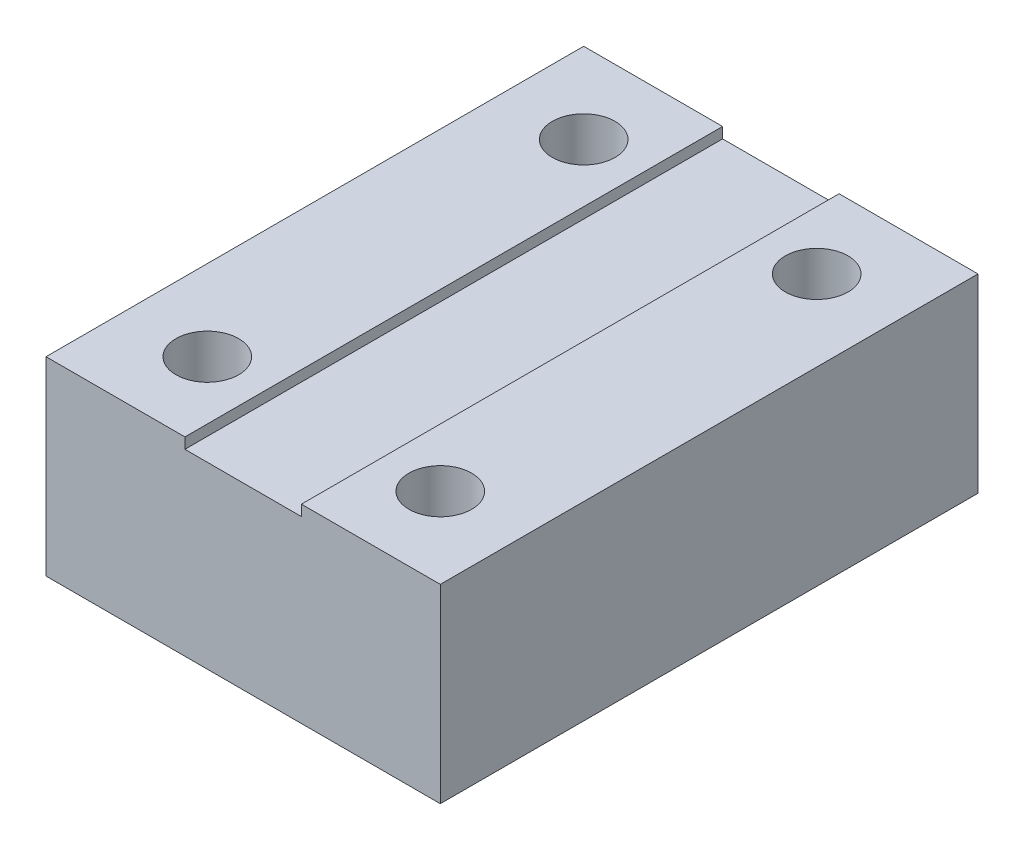
ISO-10303-21;
HEADER;
FILE_DESCRIPTION(('STEP AP214'),'2;1');
FILE_NAME('part.step','',(''),(''),'','','');
FILE_SCHEMA(('AUTOMOTIVE_DESIGN { 1 0 10303 214 1 1 1 1 }'));
ENDSEC;
DATA;
#1=APPLICATION_CONTEXT('core data for automotive mechanical design processes');
#2=APPLICATION_PROTOCOL_DEFINITION('international standard','automotive_design',2000,#1);
#3=PRODUCT_CONTEXT('',#1,'mechanical');
#4=PRODUCT('Part','Part','',(#3));
#5=PRODUCT_RELATED_PRODUCT_CATEGORY('part','',(#4));
#6=PRODUCT_DEFINITION_FORMATION('','',#4);
#7=PRODUCT_DEFINITION_CONTEXT('part definition',#1,'design');
#8=PRODUCT_DEFINITION('design','',#6,#7);
#9=PRODUCT_DEFINITION_SHAPE('','',#8);
#10=(LENGTH_UNIT() NAMED_UNIT(*) SI_UNIT(.MILLI.,.METRE.));
#11=(NAMED_UNIT(*) PLANE_ANGLE_UNIT() SI_UNIT($,.RADIAN.));
#12=(NAMED_UNIT(*) SI_UNIT($,.STERADIAN.) SOLID_ANGLE_UNIT());
#13=UNCERTAINTY_MEASURE_WITH_UNIT(LENGTH_MEASURE(1.E-05),#10,'distance_accuracy_value','');
#14=(GEOMETRIC_REPRESENTATION_CONTEXT(3) GLOBAL_UNCERTAINTY_ASSIGNED_CONTEXT((#13)) GLOBAL_UNIT_ASSIGNED_CONTEXT((#10,
#11,#12)) REPRESENTATION_CONTEXT('',''));
#15=CARTESIAN_POINT('',(0.,0.,0.));
#16=DIRECTION('',(0.,0.,1.));
#17=DIRECTION('',(1.,0.,0.));
#18=AXIS2_PLACEMENT_3D('',#15,#16,#17);
#19=CARTESIAN_POINT('',(-11.,5.3,15.));
#20=DIRECTION('',(0.,-1.,0.));
#21=DIRECTION('',(0.,0.,-1.));
#22=AXIS2_PLACEMENT_3D('',#19,#20,#21);
#23=PLANE('',#22);
#24=CARTESIAN_POINT('',(-6.5,5.3,10.5));
#25=DIRECTION('',(0.,1.,0.));
#26=DIRECTION('',(0.,0.,1.));
#27=AXIS2_PLACEMENT_3D('',#24,#25,#26);
#28=CIRCLE('',#27,1.75);
#29=CARTESIAN_POINT('',(-6.5,5.3,12.25));
#30=VERTEX_POINT('',#29);
#31=EDGE_CURVE('E156',#30,#30,#28,.T.);
#32=ORIENTED_EDGE('',*,*,#31,.F.);
#33=EDGE_LOOP('',(#32));
#34=FACE_BOUND('',#33,.T.);
#35=CARTESIAN_POINT('',(-6.5,5.3,-10.5));
#36=DIRECTION('',(0.,1.,0.));
#37=DIRECTION('',(0.,0.,1.));
#38=AXIS2_PLACEMENT_3D('',#35,#36,#37);
#39=CIRCLE('',#38,1.75);
#40=CARTESIAN_POINT('',(-6.5,5.3,-8.75));
#41=VERTEX_POINT('',#40);
#42=EDGE_CURVE('E159',#41,#41,#39,.T.);
#43=ORIENTED_EDGE('',*,*,#42,.F.);
#44=EDGE_LOOP('',(#43));
#45=FACE_BOUND('',#44,.T.);
#46=DIRECTION('',(0.,0.,-1.));
#47=VECTOR('',#46,1.);
#48=CARTESIAN_POINT('',(-3.25,5.3,15.));
#49=LINE('',#48,#47);
#50=CARTESIAN_POINT('',(-3.25,5.3,15.));
#51=VERTEX_POINT('',#50);
#52=CARTESIAN_POINT('',(-3.25,5.3,-15.));
#53=VERTEX_POINT('',#52);
#54=EDGE_CURVE('E122',#51,#53,#49,.T.);
#55=ORIENTED_EDGE('',*,*,#54,.T.);
#56=DIRECTION('',(-1.,0.,0.));
#57=VECTOR('',#56,1.);
#58=CARTESIAN_POINT('',(-11.,5.3,-15.));
#59=LINE('',#58,#57);
#60=CARTESIAN_POINT('',(-11.,5.3,-15.));
#61=VERTEX_POINT('',#60);
#62=EDGE_CURVE('E176',#53,#61,#59,.T.);
#63=ORIENTED_EDGE('',*,*,#62,.T.);
#64=DIRECTION('',(0.,0.,-1.));
#65=VECTOR('',#64,1.);
#66=CARTESIAN_POINT('',(-11.,5.3,15.));
#67=LINE('',#66,#65);
#68=CARTESIAN_POINT('',(-11.,5.3,15.));
#69=VERTEX_POINT('',#68);
#70=EDGE_CURVE('E43',#69,#61,#67,.T.);
#71=ORIENTED_EDGE('',*,*,#70,.F.);
#72=DIRECTION('',(-1.,0.,0.));
#73=VECTOR('',#72,1.);
#74=CARTESIAN_POINT('',(-11.,5.3,15.));
#75=LINE('',#74,#73);
#76=EDGE_CURVE('E168',#51,#69,#75,.T.);
#77=ORIENTED_EDGE('',*,*,#76,.F.);
#78=EDGE_LOOP('',(#55,#63,#71,#77));
#79=FACE_BOUND('',#78,.T.);
#80=ADVANCED_FACE('F35',(#34,#45,#79),#23,.F.);
#81=CARTESIAN_POINT('',(0.,0.,15.));
#82=DIRECTION('',(0.,0.,-1.));
#83=DIRECTION('',(-1.,0.,0.));
#84=AXIS2_PLACEMENT_3D('',#81,#82,#83);
#85=PLANE('',#84);
#86=DIRECTION('',(0.,1.,0.));
#87=VECTOR('',#86,1.);
#88=CARTESIAN_POINT('',(-3.25,4.7,15.));
#89=LINE('',#88,#87);
#90=CARTESIAN_POINT('',(-3.25,4.7,15.));
#91=VERTEX_POINT('',#90);
#92=EDGE_CURVE('E119',#91,#51,#89,.T.);
#93=ORIENTED_EDGE('',*,*,#92,.T.);
#94=ORIENTED_EDGE('',*,*,#76,.T.);
#95=DIRECTION('',(0.,-1.,0.));
#96=VECTOR('',#95,1.);
#97=CARTESIAN_POINT('',(-11.,-5.3,15.));
#98=LINE('',#97,#96);
#99=CARTESIAN_POINT('',(-11.,-5.3,15.));
#100=VERTEX_POINT('',#99);
#101=EDGE_CURVE('E170',#69,#100,#98,.T.);
#102=ORIENTED_EDGE('',*,*,#101,.T.);
#103=DIRECTION('',(1.,0.,0.));
#104=VECTOR('',#103,1.);
#105=CARTESIAN_POINT('',(-11.,-5.3,15.));
#106=LINE('',#105,#104);
#107=CARTESIAN_POINT('',(11.,-5.3,15.));
#108=VERTEX_POINT('',#107);
#109=EDGE_CURVE('E59',#100,#108,#106,.T.);
#110=ORIENTED_EDGE('',*,*,#109,.T.);
#111=DIRECTION('',(0.,1.,0.));
#112=VECTOR('',#111,1.);
#113=CARTESIAN_POINT('',(11.,-5.3,15.));
#114=LINE('',#113,#112);
#115=CARTESIAN_POINT('',(11.,5.3,15.));
#116=VERTEX_POINT('',#115);
#117=EDGE_CURVE('E166',#108,#116,#114,.T.);
#118=ORIENTED_EDGE('',*,*,#117,.T.);
#119=CARTESIAN_POINT('',(3.25,5.3,15.));
#120=VERTEX_POINT('',#119);
#121=EDGE_CURVE('E87',#116,#120,#75,.T.);
#122=ORIENTED_EDGE('',*,*,#121,.T.);
#123=DIRECTION('',(0.,1.,0.));
#124=VECTOR('',#123,1.);
#125=CARTESIAN_POINT('',(3.25,4.7,15.));
#126=LINE('',#125,#124);
#127=CARTESIAN_POINT('',(3.25,4.7,15.));
#128=VERTEX_POINT('',#127);
#129=EDGE_CURVE('E129',#128,#120,#126,.T.);
#130=ORIENTED_EDGE('',*,*,#129,.F.);
#131=DIRECTION('',(-1.,0.,0.));
#132=VECTOR('',#131,1.);
#133=CARTESIAN_POINT('',(3.25,4.7,15.));
#134=LINE('',#133,#132);
#135=EDGE_CURVE('E112',#128,#91,#134,.T.);
#136=ORIENTED_EDGE('',*,*,#135,.T.);
#137=EDGE_LOOP('',(#93,#94,#102,#110,#118,#122,#130,#136));
#138=FACE_BOUND('',#137,.T.);
#139=ADVANCED_FACE('F128',(#138),#85,.F.);
#140=CARTESIAN_POINT('',(0.,0.,-15.));
#141=DIRECTION('',(0.,0.,-1.));
#142=DIRECTION('',(-1.,0.,0.));
#143=AXIS2_PLACEMENT_3D('',#140,#141,#142);
#144=PLANE('',#143);
#145=ORIENTED_EDGE('',*,*,#62,.F.);
#146=DIRECTION('',(0.,1.,0.));
#147=VECTOR('',#146,1.);
#148=CARTESIAN_POINT('',(-3.25,4.7,-15.));
#149=LINE('',#148,#147);
#150=CARTESIAN_POINT('',(-3.25,4.7,-15.));
#151=VERTEX_POINT('',#150);
#152=EDGE_CURVE('E125',#151,#53,#149,.T.);
#153=ORIENTED_EDGE('',*,*,#152,.F.);
#154=DIRECTION('',(-1.,0.,0.));
#155=VECTOR('',#154,1.);
#156=CARTESIAN_POINT('',(3.25,4.7,-15.));
#157=LINE('',#156,#155);
#158=CARTESIAN_POINT('',(3.25,4.7,-15.));
#159=VERTEX_POINT('',#158);
#160=EDGE_CURVE('E114',#159,#151,#157,.T.);
#161=ORIENTED_EDGE('',*,*,#160,.F.);
#162=DIRECTION('',(0.,1.,0.));
#163=VECTOR('',#162,1.);
#164=CARTESIAN_POINT('',(3.25,4.7,-15.));
#165=LINE('',#164,#163);
#166=CARTESIAN_POINT('',(3.25,5.3,-15.));
#167=VERTEX_POINT('',#166);
#168=EDGE_CURVE('E138',#159,#167,#165,.T.);
#169=ORIENTED_EDGE('',*,*,#168,.T.);
#170=CARTESIAN_POINT('',(11.,5.3,-15.));
#171=VERTEX_POINT('',#170);
#172=EDGE_CURVE('E177',#171,#167,#59,.T.);
#173=ORIENTED_EDGE('',*,*,#172,.F.);
#174=DIRECTION('',(0.,1.,0.));
#175=VECTOR('',#174,1.);
#176=CARTESIAN_POINT('',(11.,-5.3,-15.));
#177=LINE('',#176,#175);
#178=CARTESIAN_POINT('',(11.,-5.3,-15.));
#179=VERTEX_POINT('',#178);
#180=EDGE_CURVE('E165',#179,#171,#177,.T.);
#181=ORIENTED_EDGE('',*,*,#180,.F.);
#182=DIRECTION('',(1.,0.,0.));
#183=VECTOR('',#182,1.);
#184=CARTESIAN_POINT('',(-11.,-5.3,-15.));
#185=LINE('',#184,#183);
#186=CARTESIAN_POINT('',(-11.,-5.3,-15.));
#187=VERTEX_POINT('',#186);
#188=EDGE_CURVE('E80',#187,#179,#185,.T.);
#189=ORIENTED_EDGE('',*,*,#188,.F.);
#190=DIRECTION('',(0.,-1.,0.));
#191=VECTOR('',#190,1.);
#192=CARTESIAN_POINT('',(-11.,-5.3,-15.));
#193=LINE('',#192,#191);
#194=EDGE_CURVE('E180',#61,#187,#193,.T.);
#195=ORIENTED_EDGE('',*,*,#194,.F.);
#196=EDGE_LOOP('',(#145,#153,#161,#169,#173,#181,#189,#195));
#197=FACE_BOUND('',#196,.T.);
#198=ADVANCED_FACE('F195',(#197),#144,.T.);
#199=CARTESIAN_POINT('',(11.,-5.3,15.));
#200=DIRECTION('',(-1.,0.,0.));
#201=DIRECTION('',(0.,0.,1.));
#202=AXIS2_PLACEMENT_3D('',#199,#200,#201);
#203=PLANE('',#202);
#204=ORIENTED_EDGE('',*,*,#180,.T.);
#205=DIRECTION('',(0.,0.,-1.));
#206=VECTOR('',#205,1.);
#207=CARTESIAN_POINT('',(11.,5.3,15.));
#208=LINE('',#207,#206);
#209=EDGE_CURVE('E11',#116,#171,#208,.T.);
#210=ORIENTED_EDGE('',*,*,#209,.F.);
#211=ORIENTED_EDGE('',*,*,#117,.F.);
#212=DIRECTION('',(0.,0.,-1.));
#213=VECTOR('',#212,1.);
#214=CARTESIAN_POINT('',(11.,-5.3,15.));
#215=LINE('',#214,#213);
#216=EDGE_CURVE('E173',#108,#179,#215,.T.);
#217=ORIENTED_EDGE('',*,*,#216,.T.);
#218=EDGE_LOOP('',(#204,#210,#211,#217));
#219=FACE_BOUND('',#218,.T.);
#220=ADVANCED_FACE('F37',(#219),#203,.F.);
#221=CARTESIAN_POINT('',(6.5,5.3,-10.5));
#222=DIRECTION('',(0.,1.,0.));
#223=DIRECTION('',(0.,0.,1.));
#224=AXIS2_PLACEMENT_3D('',#221,#222,#223);
#225=CIRCLE('',#224,1.75);
#226=CARTESIAN_POINT('',(6.5,5.3,-8.75));
#227=VERTEX_POINT('',#226);
#228=EDGE_CURVE('E144',#227,#227,#225,.T.);
#229=ORIENTED_EDGE('',*,*,#228,.F.);
#230=EDGE_LOOP('',(#229));
#231=FACE_BOUND('',#230,.T.);
#232=CARTESIAN_POINT('',(6.5,5.3,10.5));
#233=DIRECTION('',(0.,1.,0.));
#234=DIRECTION('',(0.,0.,1.));
#235=AXIS2_PLACEMENT_3D('',#232,#233,#234);
#236=CIRCLE('',#235,1.75);
#237=CARTESIAN_POINT('',(6.5,5.3,12.25));
#238=VERTEX_POINT('',#237);
#239=EDGE_CURVE('E150',#238,#238,#236,.T.);
#240=ORIENTED_EDGE('',*,*,#239,.F.);
#241=EDGE_LOOP('',(#240));
#242=FACE_BOUND('',#241,.T.);
#243=ORIENTED_EDGE('',*,*,#172,.T.);
#244=DIRECTION('',(0.,0.,-1.));
#245=VECTOR('',#244,1.);
#246=CARTESIAN_POINT('',(3.25,5.3,15.));
#247=LINE('',#246,#245);
#248=EDGE_CURVE('E130',#120,#167,#247,.T.);
#249=ORIENTED_EDGE('',*,*,#248,.F.);
#250=ORIENTED_EDGE('',*,*,#121,.F.);
#251=ORIENTED_EDGE('',*,*,#209,.T.);
#252=EDGE_LOOP('',(#243,#249,#250,#251));
#253=FACE_BOUND('',#252,.T.);
#254=ADVANCED_FACE('F212',(#231,#242,#253),#23,.F.);
#255=CARTESIAN_POINT('',(-11.,-5.3,15.));
#256=DIRECTION('',(1.,0.,0.));
#257=DIRECTION('',(0.,0.,-1.));
#258=AXIS2_PLACEMENT_3D('',#255,#256,#257);
#259=PLANE('',#258);
#260=ORIENTED_EDGE('',*,*,#194,.T.);
#261=DIRECTION('',(0.,0.,-1.));
#262=VECTOR('',#261,1.);
#263=CARTESIAN_POINT('',(-11.,-5.3,15.));
#264=LINE('',#263,#262);
#265=EDGE_CURVE('E184',#100,#187,#264,.T.);
#266=ORIENTED_EDGE('',*,*,#265,.F.);
#267=ORIENTED_EDGE('',*,*,#101,.F.);
#268=ORIENTED_EDGE('',*,*,#70,.T.);
#269=EDGE_LOOP('',(#260,#266,#267,#268));
#270=FACE_BOUND('',#269,.T.);
#271=ADVANCED_FACE('F190',(#270),#259,.F.);
#272=CARTESIAN_POINT('',(-11.,-5.3,15.));
#273=DIRECTION('',(0.,1.,0.));
#274=DIRECTION('',(0.,0.,1.));
#275=AXIS2_PLACEMENT_3D('',#272,#273,#274);
#276=PLANE('',#275);
#277=CARTESIAN_POINT('',(6.5,-5.3,-10.5));
#278=DIRECTION('',(0.,1.,0.));
#279=DIRECTION('',(0.,0.,1.));
#280=AXIS2_PLACEMENT_3D('',#277,#278,#279);
#281=CIRCLE('',#280,1.75);
#282=CARTESIAN_POINT('',(6.5,-5.3,-8.75));
#283=VERTEX_POINT('',#282);
#284=EDGE_CURVE('E124',#283,#283,#281,.F.);
#285=ORIENTED_EDGE('',*,*,#284,.F.);
#286=EDGE_LOOP('',(#285));
#287=FACE_BOUND('',#286,.T.);
#288=CARTESIAN_POINT('',(6.5,-5.3,10.5));
#289=DIRECTION('',(0.,1.,0.));
#290=DIRECTION('',(0.,0.,1.));
#291=AXIS2_PLACEMENT_3D('',#288,#289,#290);
#292=CIRCLE('',#291,1.75);
#293=CARTESIAN_POINT('',(6.5,-5.3,12.25));
#294=VERTEX_POINT('',#293);
#295=EDGE_CURVE('E147',#294,#294,#292,.F.);
#296=ORIENTED_EDGE('',*,*,#295,.F.);
#297=EDGE_LOOP('',(#296));
#298=FACE_BOUND('',#297,.T.);
#299=CARTESIAN_POINT('',(-6.5,-5.3,10.5));
#300=DIRECTION('',(0.,1.,0.));
#301=DIRECTION('',(0.,0.,1.));
#302=AXIS2_PLACEMENT_3D('',#299,#300,#301);
#303=CIRCLE('',#302,1.75);
#304=CARTESIAN_POINT('',(-6.5,-5.3,12.25));
#305=VERTEX_POINT('',#304);
#306=EDGE_CURVE('E153',#305,#305,#303,.F.);
#307=ORIENTED_EDGE('',*,*,#306,.F.);
#308=EDGE_LOOP('',(#307));
#309=FACE_BOUND('',#308,.T.);
#310=CARTESIAN_POINT('',(-6.5,-5.3,-10.5));
#311=DIRECTION('',(0.,1.,0.));
#312=DIRECTION('',(0.,0.,1.));
#313=AXIS2_PLACEMENT_3D('',#310,#311,#312);
#314=CIRCLE('',#313,1.75);
#315=CARTESIAN_POINT('',(-6.5,-5.3,-8.75));
#316=VERTEX_POINT('',#315);
#317=EDGE_CURVE('E162',#316,#316,#314,.F.);
#318=ORIENTED_EDGE('',*,*,#317,.F.);
#319=EDGE_LOOP('',(#318));
#320=FACE_BOUND('',#319,.T.);
#321=ORIENTED_EDGE('',*,*,#188,.T.);
#322=ORIENTED_EDGE('',*,*,#216,.F.);
#323=ORIENTED_EDGE('',*,*,#109,.F.);
#324=ORIENTED_EDGE('',*,*,#265,.T.);
#325=EDGE_LOOP('',(#321,#322,#323,#324));
#326=FACE_BOUND('',#325,.T.);
#327=ADVANCED_FACE('F200',(#287,#298,#309,#320,#326),#276,.F.);
#328=CARTESIAN_POINT('',(-6.5,-5.301,-10.5));
#329=DIRECTION('',(0.,1.,0.));
#330=DIRECTION('',(0.,0.,1.));
#331=AXIS2_PLACEMENT_3D('',#328,#329,#330);
#332=CYLINDRICAL_SURFACE('',#331,1.75);
#333=ORIENTED_EDGE('',*,*,#42,.T.);
#334=EDGE_LOOP('',(#333));
#335=FACE_BOUND('',#334,.T.);
#336=ORIENTED_EDGE('',*,*,#317,.T.);
#337=EDGE_LOOP('',(#336));
#338=FACE_BOUND('',#337,.T.);
#339=ADVANCED_FACE('F202',(#335,#338),#332,.F.);
#340=CARTESIAN_POINT('',(-6.5,-5.301,10.5));
#341=DIRECTION('',(0.,1.,0.));
#342=DIRECTION('',(0.,0.,1.));
#343=AXIS2_PLACEMENT_3D('',#340,#341,#342);
#344=CYLINDRICAL_SURFACE('',#343,1.75);
#345=ORIENTED_EDGE('',*,*,#31,.T.);
#346=EDGE_LOOP('',(#345));
#347=FACE_BOUND('',#346,.T.);
#348=ORIENTED_EDGE('',*,*,#306,.T.);
#349=EDGE_LOOP('',(#348));
#350=FACE_BOUND('',#349,.T.);
#351=ADVANCED_FACE('F209',(#347,#350),#344,.F.);
#352=CARTESIAN_POINT('',(6.5,-5.301,10.5));
#353=DIRECTION('',(0.,1.,0.));
#354=DIRECTION('',(0.,0.,1.));
#355=AXIS2_PLACEMENT_3D('',#352,#353,#354);
#356=CYLINDRICAL_SURFACE('',#355,1.75);
#357=ORIENTED_EDGE('',*,*,#239,.T.);
#358=EDGE_LOOP('',(#357));
#359=FACE_BOUND('',#358,.T.);
#360=ORIENTED_EDGE('',*,*,#295,.T.);
#361=EDGE_LOOP('',(#360));
#362=FACE_BOUND('',#361,.T.);
#363=ADVANCED_FACE('F247',(#359,#362),#356,.F.);
#364=CARTESIAN_POINT('',(6.5,-5.301,-10.5));
#365=DIRECTION('',(0.,1.,0.));
#366=DIRECTION('',(0.,0.,1.));
#367=AXIS2_PLACEMENT_3D('',#364,#365,#366);
#368=CYLINDRICAL_SURFACE('',#367,1.75);
#369=ORIENTED_EDGE('',*,*,#228,.T.);
#370=EDGE_LOOP('',(#369));
#371=FACE_BOUND('',#370,.T.);
#372=ORIENTED_EDGE('',*,*,#284,.T.);
#373=EDGE_LOOP('',(#372));
#374=FACE_BOUND('',#373,.T.);
#375=ADVANCED_FACE('F242',(#371,#374),#368,.F.);
#376=CARTESIAN_POINT('',(-3.25,4.7,15.));
#377=DIRECTION('',(1.,0.,0.));
#378=DIRECTION('',(0.,0.,-1.));
#379=AXIS2_PLACEMENT_3D('',#376,#377,#378);
#380=PLANE('',#379);
#381=ORIENTED_EDGE('',*,*,#54,.F.);
#382=ORIENTED_EDGE('',*,*,#92,.F.);
#383=DIRECTION('',(0.,0.,-1.));
#384=VECTOR('',#383,1.);
#385=CARTESIAN_POINT('',(-3.25,4.7,15.));
#386=LINE('',#385,#384);
#387=EDGE_CURVE('E108',#91,#151,#386,.T.);
#388=ORIENTED_EDGE('',*,*,#387,.T.);
#389=ORIENTED_EDGE('',*,*,#152,.T.);
#390=EDGE_LOOP('',(#381,#382,#388,#389));
#391=FACE_BOUND('',#390,.T.);
#392=ADVANCED_FACE('F120',(#391),#380,.T.);
#393=CARTESIAN_POINT('',(3.25,4.7,15.));
#394=DIRECTION('',(1.,0.,0.));
#395=DIRECTION('',(0.,0.,-1.));
#396=AXIS2_PLACEMENT_3D('',#393,#394,#395);
#397=PLANE('',#396);
#398=ORIENTED_EDGE('',*,*,#248,.T.);
#399=ORIENTED_EDGE('',*,*,#168,.F.);
#400=DIRECTION('',(0.,0.,-1.));
#401=VECTOR('',#400,1.);
#402=CARTESIAN_POINT('',(3.25,4.7,15.));
#403=LINE('',#402,#401);
#404=EDGE_CURVE('E50',#128,#159,#403,.T.);
#405=ORIENTED_EDGE('',*,*,#404,.F.);
#406=ORIENTED_EDGE('',*,*,#129,.T.);
#407=EDGE_LOOP('',(#398,#399,#405,#406));
#408=FACE_BOUND('',#407,.T.);
#409=ADVANCED_FACE('F234',(#408),#397,.F.);
#410=CARTESIAN_POINT('',(0.,4.7,0.));
#411=DIRECTION('',(0.,-1.,0.));
#412=DIRECTION('',(0.,0.,-1.));
#413=AXIS2_PLACEMENT_3D('',#410,#411,#412);
#414=PLANE('',#413);
#415=ORIENTED_EDGE('',*,*,#135,.F.);
#416=ORIENTED_EDGE('',*,*,#404,.T.);
#417=ORIENTED_EDGE('',*,*,#160,.T.);
#418=ORIENTED_EDGE('',*,*,#387,.F.);
#419=EDGE_LOOP('',(#415,#416,#417,#418));
#420=FACE_BOUND('',#419,.T.);
#421=ADVANCED_FACE('F110',(#420),#414,.F.);
#422=CLOSED_SHELL('',(#80,#139,#198,#220,#254,#271,#327,#339,#351,#363,#375,#392,#409,#421));
#423=MANIFOLD_SOLID_BREP('B2',#422);
#424=ADVANCED_BREP_SHAPE_REPRESENTATION('',(#18,#423),#14);
#425=SHAPE_DEFINITION_REPRESENTATION(#9,#424);
ENDSEC;
END-ISO-10303-21;
